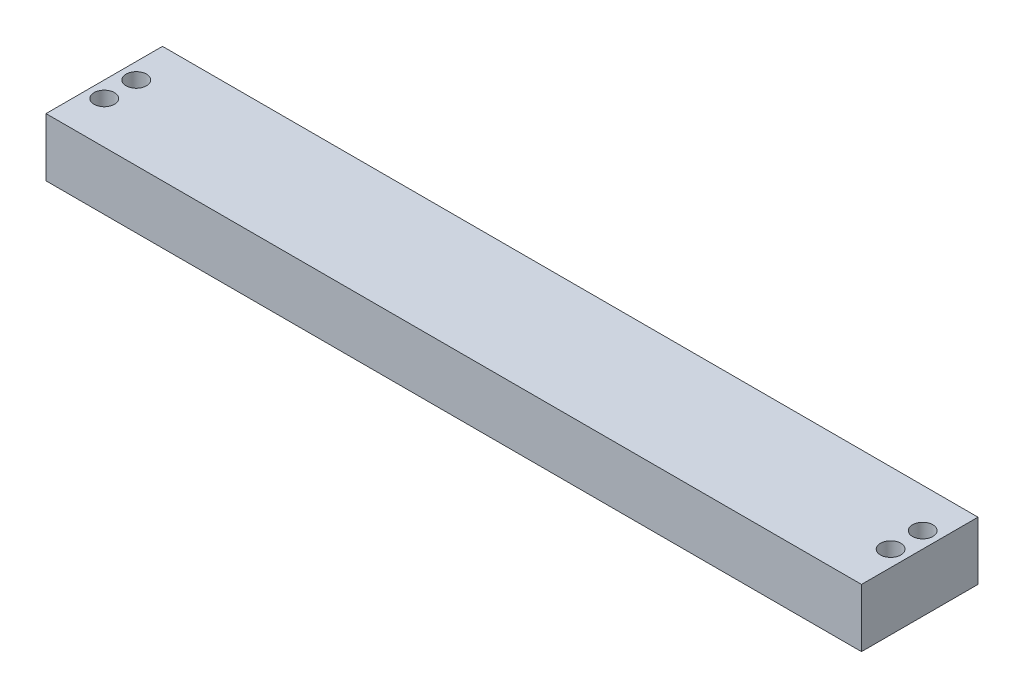
ISO-10303-21;
HEADER;
FILE_DESCRIPTION(('STEP AP214'),'2;1');
FILE_NAME('part.step','',(''),(''),'','','');
FILE_SCHEMA(('AUTOMOTIVE_DESIGN { 1 0 10303 214 1 1 1 1 }'));
ENDSEC;
DATA;
#1=APPLICATION_CONTEXT('core data for automotive mechanical design processes');
#2=APPLICATION_PROTOCOL_DEFINITION('international standard','automotive_design',2000,#1);
#3=PRODUCT_CONTEXT('',#1,'mechanical');
#4=PRODUCT('Part','Part','',(#3));
#5=PRODUCT_RELATED_PRODUCT_CATEGORY('part','',(#4));
#6=PRODUCT_DEFINITION_FORMATION('','',#4);
#7=PRODUCT_DEFINITION_CONTEXT('part definition',#1,'design');
#8=PRODUCT_DEFINITION('design','',#6,#7);
#9=PRODUCT_DEFINITION_SHAPE('','',#8);
#10=(LENGTH_UNIT() NAMED_UNIT(*) SI_UNIT(.MILLI.,.METRE.));
#11=(NAMED_UNIT(*) PLANE_ANGLE_UNIT() SI_UNIT($,.RADIAN.));
#12=(NAMED_UNIT(*) SI_UNIT($,.STERADIAN.) SOLID_ANGLE_UNIT());
#13=UNCERTAINTY_MEASURE_WITH_UNIT(LENGTH_MEASURE(1.E-05),#10,'distance_accuracy_value','');
#14=(GEOMETRIC_REPRESENTATION_CONTEXT(3) GLOBAL_UNCERTAINTY_ASSIGNED_CONTEXT((#13)) GLOBAL_UNIT_ASSIGNED_CONTEXT((#10,
#11,#12)) REPRESENTATION_CONTEXT('',''));
#15=CARTESIAN_POINT('',(0.,0.,0.));
#16=DIRECTION('',(0.,0.,1.));
#17=DIRECTION('',(1.,0.,0.));
#18=AXIS2_PLACEMENT_3D('',#15,#16,#17);
#19=CARTESIAN_POINT('',(-140.,9.99999999999999,40.));
#20=DIRECTION('',(1.,0.,0.));
#21=DIRECTION('',(0.,0.,-1.));
#22=AXIS2_PLACEMENT_3D('',#19,#20,#21);
#23=PLANE('',#22);
#24=DIRECTION('',(0.,-1.,0.));
#25=VECTOR('',#24,1.);
#26=CARTESIAN_POINT('',(-140.,9.99999999999999,0.));
#27=LINE('',#26,#25);
#28=CARTESIAN_POINT('',(-140.,9.99999999999999,0.));
#29=VERTEX_POINT('',#28);
#30=CARTESIAN_POINT('',(-140.,-10.,0.));
#31=VERTEX_POINT('',#30);
#32=EDGE_CURVE('E114',#29,#31,#27,.T.);
#33=ORIENTED_EDGE('',*,*,#32,.T.);
#34=DIRECTION('',(0.,0.,-1.));
#35=VECTOR('',#34,1.);
#36=CARTESIAN_POINT('',(-140.,-10.,40.));
#37=LINE('',#36,#35);
#38=CARTESIAN_POINT('',(-140.,-10.,40.));
#39=VERTEX_POINT('',#38);
#40=EDGE_CURVE('E11',#39,#31,#37,.T.);
#41=ORIENTED_EDGE('',*,*,#40,.F.);
#42=DIRECTION('',(0.,-1.,0.));
#43=VECTOR('',#42,1.);
#44=CARTESIAN_POINT('',(-140.,9.99999999999999,40.));
#45=LINE('',#44,#43);
#46=CARTESIAN_POINT('',(-140.,9.99999999999999,40.));
#47=VERTEX_POINT('',#46);
#48=EDGE_CURVE('E95',#47,#39,#45,.T.);
#49=ORIENTED_EDGE('',*,*,#48,.F.);
#50=DIRECTION('',(0.,0.,-1.));
#51=VECTOR('',#50,1.);
#52=CARTESIAN_POINT('',(-140.,9.99999999999999,40.));
#53=LINE('',#52,#51);
#54=EDGE_CURVE('E62',#47,#29,#53,.T.);
#55=ORIENTED_EDGE('',*,*,#54,.T.);
#56=EDGE_LOOP('',(#33,#41,#49,#55));
#57=FACE_BOUND('',#56,.T.);
#58=ADVANCED_FACE('F43',(#57),#23,.F.);
#59=CARTESIAN_POINT('',(-140.,-10.,40.));
#60=DIRECTION('',(0.,1.,0.));
#61=DIRECTION('',(0.,0.,1.));
#62=AXIS2_PLACEMENT_3D('',#59,#60,#61);
#63=PLANE('',#62);
#64=CARTESIAN_POINT('',(-134.5,-10.,14.5));
#65=DIRECTION('',(0.,-1.,0.));
#66=DIRECTION('',(0.,0.,-1.));
#67=AXIS2_PLACEMENT_3D('',#64,#65,#66);
#68=CIRCLE('',#67,3.49999999999999);
#69=CARTESIAN_POINT('',(-134.5,-10.,11.));
#70=VERTEX_POINT('',#69);
#71=EDGE_CURVE('E165',#70,#70,#68,.T.);
#72=ORIENTED_EDGE('',*,*,#71,.F.);
#73=EDGE_LOOP('',(#72));
#74=FACE_BOUND('',#73,.T.);
#75=CARTESIAN_POINT('',(134.5,-10.,24.5));
#76=DIRECTION('',(0.,-1.,0.));
#77=DIRECTION('',(0.,0.,-1.));
#78=AXIS2_PLACEMENT_3D('',#75,#76,#77);
#79=CIRCLE('',#78,3.49999999999999);
#80=CARTESIAN_POINT('',(134.5,-10.,21.));
#81=VERTEX_POINT('',#80);
#82=EDGE_CURVE('E166',#81,#81,#79,.T.);
#83=ORIENTED_EDGE('',*,*,#82,.F.);
#84=EDGE_LOOP('',(#83));
#85=FACE_BOUND('',#84,.T.);
#86=CARTESIAN_POINT('',(134.5,-10.,13.5));
#87=DIRECTION('',(0.,-1.,0.));
#88=DIRECTION('',(0.,0.,-1.));
#89=AXIS2_PLACEMENT_3D('',#86,#87,#88);
#90=CIRCLE('',#89,3.49999999999999);
#91=CARTESIAN_POINT('',(134.5,-10.,10.));
#92=VERTEX_POINT('',#91);
#93=EDGE_CURVE('E170',#92,#92,#90,.T.);
#94=ORIENTED_EDGE('',*,*,#93,.F.);
#95=EDGE_LOOP('',(#94));
#96=FACE_BOUND('',#95,.T.);
#97=CARTESIAN_POINT('',(-134.5,-10.,25.5));
#98=DIRECTION('',(0.,-1.,0.));
#99=DIRECTION('',(0.,0.,-1.));
#100=AXIS2_PLACEMENT_3D('',#97,#98,#99);
#101=CIRCLE('',#100,3.49999999999999);
#102=CARTESIAN_POINT('',(-134.5,-10.,22.));
#103=VERTEX_POINT('',#102);
#104=EDGE_CURVE('E135',#103,#103,#101,.T.);
#105=ORIENTED_EDGE('',*,*,#104,.F.);
#106=EDGE_LOOP('',(#105));
#107=FACE_BOUND('',#106,.T.);
#108=DIRECTION('',(1.,0.,0.));
#109=VECTOR('',#108,1.);
#110=CARTESIAN_POINT('',(-140.,-10.,0.));
#111=LINE('',#110,#109);
#112=CARTESIAN_POINT('',(140.,-10.,0.));
#113=VERTEX_POINT('',#112);
#114=EDGE_CURVE('E101',#31,#113,#111,.T.);
#115=ORIENTED_EDGE('',*,*,#114,.T.);
#116=DIRECTION('',(0.,0.,-1.));
#117=VECTOR('',#116,1.);
#118=CARTESIAN_POINT('',(140.,-10.,40.));
#119=LINE('',#118,#117);
#120=CARTESIAN_POINT('',(140.,-10.,40.));
#121=VERTEX_POINT('',#120);
#122=EDGE_CURVE('E53',#121,#113,#119,.T.);
#123=ORIENTED_EDGE('',*,*,#122,.F.);
#124=DIRECTION('',(1.,0.,0.));
#125=VECTOR('',#124,1.);
#126=CARTESIAN_POINT('',(-140.,-10.,40.));
#127=LINE('',#126,#125);
#128=EDGE_CURVE('E87',#39,#121,#127,.T.);
#129=ORIENTED_EDGE('',*,*,#128,.F.);
#130=ORIENTED_EDGE('',*,*,#40,.T.);
#131=EDGE_LOOP('',(#115,#123,#129,#130));
#132=FACE_BOUND('',#131,.T.);
#133=ADVANCED_FACE('F100',(#74,#85,#96,#107,#132),#63,.F.);
#134=CARTESIAN_POINT('',(140.,9.99999999999999,40.));
#135=DIRECTION('',(1.,0.,0.));
#136=DIRECTION('',(0.,0.,-1.));
#137=AXIS2_PLACEMENT_3D('',#134,#135,#136);
#138=PLANE('',#137);
#139=DIRECTION('',(0.,-1.,0.));
#140=VECTOR('',#139,1.);
#141=CARTESIAN_POINT('',(140.,9.99999999999999,0.));
#142=LINE('',#141,#140);
#143=CARTESIAN_POINT('',(140.,9.99999999999999,0.));
#144=VERTEX_POINT('',#143);
#145=EDGE_CURVE('E119',#144,#113,#142,.T.);
#146=ORIENTED_EDGE('',*,*,#145,.F.);
#147=DIRECTION('',(0.,0.,-1.));
#148=VECTOR('',#147,1.);
#149=CARTESIAN_POINT('',(140.,9.99999999999999,40.));
#150=LINE('',#149,#148);
#151=CARTESIAN_POINT('',(140.,9.99999999999999,40.));
#152=VERTEX_POINT('',#151);
#153=EDGE_CURVE('E76',#152,#144,#150,.T.);
#154=ORIENTED_EDGE('',*,*,#153,.F.);
#155=DIRECTION('',(0.,-1.,0.));
#156=VECTOR('',#155,1.);
#157=CARTESIAN_POINT('',(140.,9.99999999999999,40.));
#158=LINE('',#157,#156);
#159=EDGE_CURVE('E94',#152,#121,#158,.T.);
#160=ORIENTED_EDGE('',*,*,#159,.T.);
#161=ORIENTED_EDGE('',*,*,#122,.T.);
#162=EDGE_LOOP('',(#146,#154,#160,#161));
#163=FACE_BOUND('',#162,.T.);
#164=ADVANCED_FACE('F106',(#163),#138,.T.);
#165=CARTESIAN_POINT('',(-140.,9.99999999999999,40.));
#166=DIRECTION('',(0.,1.,0.));
#167=DIRECTION('',(0.,0.,1.));
#168=AXIS2_PLACEMENT_3D('',#165,#166,#167);
#169=PLANE('',#168);
#170=CARTESIAN_POINT('',(-134.5,9.99999999999999,14.5));
#171=DIRECTION('',(0.,1.,0.));
#172=DIRECTION('',(0.,0.,1.));
#173=AXIS2_PLACEMENT_3D('',#170,#171,#172);
#174=CIRCLE('',#173,3.49999999999999);
#175=CARTESIAN_POINT('',(-134.5,9.99999999999999,18.));
#176=VERTEX_POINT('',#175);
#177=EDGE_CURVE('E46',#176,#176,#174,.T.);
#178=ORIENTED_EDGE('',*,*,#177,.F.);
#179=EDGE_LOOP('',(#178));
#180=FACE_BOUND('',#179,.T.);
#181=CARTESIAN_POINT('',(134.5,9.99999999999999,24.5));
#182=DIRECTION('',(0.,1.,0.));
#183=DIRECTION('',(0.,0.,1.));
#184=AXIS2_PLACEMENT_3D('',#181,#182,#183);
#185=CIRCLE('',#184,3.49999999999999);
#186=CARTESIAN_POINT('',(134.5,9.99999999999999,28.));
#187=VERTEX_POINT('',#186);
#188=EDGE_CURVE('E138',#187,#187,#185,.T.);
#189=ORIENTED_EDGE('',*,*,#188,.F.);
#190=EDGE_LOOP('',(#189));
#191=FACE_BOUND('',#190,.T.);
#192=CARTESIAN_POINT('',(134.5,9.99999999999999,13.5));
#193=DIRECTION('',(0.,1.,0.));
#194=DIRECTION('',(0.,0.,1.));
#195=AXIS2_PLACEMENT_3D('',#192,#193,#194);
#196=CIRCLE('',#195,3.49999999999999);
#197=CARTESIAN_POINT('',(134.5,9.99999999999999,17.));
#198=VERTEX_POINT('',#197);
#199=EDGE_CURVE('E134',#198,#198,#196,.T.);
#200=ORIENTED_EDGE('',*,*,#199,.F.);
#201=EDGE_LOOP('',(#200));
#202=FACE_BOUND('',#201,.T.);
#203=CARTESIAN_POINT('',(-134.5,9.99999999999999,25.5));
#204=DIRECTION('',(0.,1.,0.));
#205=DIRECTION('',(0.,0.,1.));
#206=AXIS2_PLACEMENT_3D('',#203,#204,#205);
#207=CIRCLE('',#206,3.49999999999999);
#208=CARTESIAN_POINT('',(-134.5,9.99999999999999,29.));
#209=VERTEX_POINT('',#208);
#210=EDGE_CURVE('E130',#209,#209,#207,.T.);
#211=ORIENTED_EDGE('',*,*,#210,.F.);
#212=EDGE_LOOP('',(#211));
#213=FACE_BOUND('',#212,.T.);
#214=DIRECTION('',(1.,0.,0.));
#215=VECTOR('',#214,1.);
#216=CARTESIAN_POINT('',(-140.,9.99999999999999,0.));
#217=LINE('',#216,#215);
#218=EDGE_CURVE('E122',#29,#144,#217,.T.);
#219=ORIENTED_EDGE('',*,*,#218,.F.);
#220=ORIENTED_EDGE('',*,*,#54,.F.);
#221=DIRECTION('',(1.,0.,0.));
#222=VECTOR('',#221,1.);
#223=CARTESIAN_POINT('',(-140.,9.99999999999999,40.));
#224=LINE('',#223,#222);
#225=EDGE_CURVE('E108',#47,#152,#224,.T.);
#226=ORIENTED_EDGE('',*,*,#225,.T.);
#227=ORIENTED_EDGE('',*,*,#153,.T.);
#228=EDGE_LOOP('',(#219,#220,#226,#227));
#229=FACE_BOUND('',#228,.T.);
#230=ADVANCED_FACE('F150',(#180,#191,#202,#213,#229),#169,.T.);
#231=CARTESIAN_POINT('',(0.,0.,40.));
#232=DIRECTION('',(0.,0.,1.));
#233=DIRECTION('',(1.,0.,0.));
#234=AXIS2_PLACEMENT_3D('',#231,#232,#233);
#235=PLANE('',#234);
#236=ORIENTED_EDGE('',*,*,#48,.T.);
#237=ORIENTED_EDGE('',*,*,#128,.T.);
#238=ORIENTED_EDGE('',*,*,#159,.F.);
#239=ORIENTED_EDGE('',*,*,#225,.F.);
#240=EDGE_LOOP('',(#236,#237,#238,#239));
#241=FACE_BOUND('',#240,.T.);
#242=ADVANCED_FACE('F91',(#241),#235,.T.);
#243=CARTESIAN_POINT('',(0.,0.,0.));
#244=DIRECTION('',(0.,0.,1.));
#245=DIRECTION('',(1.,0.,0.));
#246=AXIS2_PLACEMENT_3D('',#243,#244,#245);
#247=PLANE('',#246);
#248=ORIENTED_EDGE('',*,*,#32,.F.);
#249=ORIENTED_EDGE('',*,*,#218,.T.);
#250=ORIENTED_EDGE('',*,*,#145,.T.);
#251=ORIENTED_EDGE('',*,*,#114,.F.);
#252=EDGE_LOOP('',(#248,#249,#250,#251));
#253=FACE_BOUND('',#252,.T.);
#254=ADVANCED_FACE('F159',(#253),#247,.F.);
#255=CARTESIAN_POINT('',(-134.5,20.,25.5));
#256=DIRECTION('',(0.,-1.,0.));
#257=DIRECTION('',(0.,0.,-1.));
#258=AXIS2_PLACEMENT_3D('',#255,#256,#257);
#259=CYLINDRICAL_SURFACE('',#258,3.49999999999999);
#260=ORIENTED_EDGE('',*,*,#210,.T.);
#261=EDGE_LOOP('',(#260));
#262=FACE_BOUND('',#261,.T.);
#263=ORIENTED_EDGE('',*,*,#104,.T.);
#264=EDGE_LOOP('',(#263));
#265=FACE_BOUND('',#264,.T.);
#266=ADVANCED_FACE('F185',(#262,#265),#259,.F.);
#267=CARTESIAN_POINT('',(134.5,20.,13.5));
#268=DIRECTION('',(0.,-1.,0.));
#269=DIRECTION('',(0.,0.,-1.));
#270=AXIS2_PLACEMENT_3D('',#267,#268,#269);
#271=CYLINDRICAL_SURFACE('',#270,3.49999999999999);
#272=ORIENTED_EDGE('',*,*,#199,.T.);
#273=EDGE_LOOP('',(#272));
#274=FACE_BOUND('',#273,.T.);
#275=ORIENTED_EDGE('',*,*,#93,.T.);
#276=EDGE_LOOP('',(#275));
#277=FACE_BOUND('',#276,.T.);
#278=ADVANCED_FACE('F178',(#274,#277),#271,.F.);
#279=CARTESIAN_POINT('',(134.5,20.,24.5));
#280=DIRECTION('',(0.,-1.,0.));
#281=DIRECTION('',(0.,0.,-1.));
#282=AXIS2_PLACEMENT_3D('',#279,#280,#281);
#283=CYLINDRICAL_SURFACE('',#282,3.49999999999999);
#284=ORIENTED_EDGE('',*,*,#188,.T.);
#285=EDGE_LOOP('',(#284));
#286=FACE_BOUND('',#285,.T.);
#287=ORIENTED_EDGE('',*,*,#82,.T.);
#288=EDGE_LOOP('',(#287));
#289=FACE_BOUND('',#288,.T.);
#290=ADVANCED_FACE('F193',(#286,#289),#283,.F.);
#291=CARTESIAN_POINT('',(-134.5,20.,14.5));
#292=DIRECTION('',(0.,-1.,0.));
#293=DIRECTION('',(0.,0.,-1.));
#294=AXIS2_PLACEMENT_3D('',#291,#292,#293);
#295=CYLINDRICAL_SURFACE('',#294,3.49999999999999);
#296=ORIENTED_EDGE('',*,*,#177,.T.);
#297=EDGE_LOOP('',(#296));
#298=FACE_BOUND('',#297,.T.);
#299=ORIENTED_EDGE('',*,*,#71,.T.);
#300=EDGE_LOOP('',(#299));
#301=FACE_BOUND('',#300,.T.);
#302=ADVANCED_FACE('F147',(#298,#301),#295,.F.);
#303=CLOSED_SHELL('',(#58,#133,#164,#230,#242,#254,#266,#278,#290,#302));
#304=MANIFOLD_SOLID_BREP('B2',#303);
#305=ADVANCED_BREP_SHAPE_REPRESENTATION('',(#18,#304),#14);
#306=SHAPE_DEFINITION_REPRESENTATION(#9,#305);
ENDSEC;
END-ISO-10303-21;
